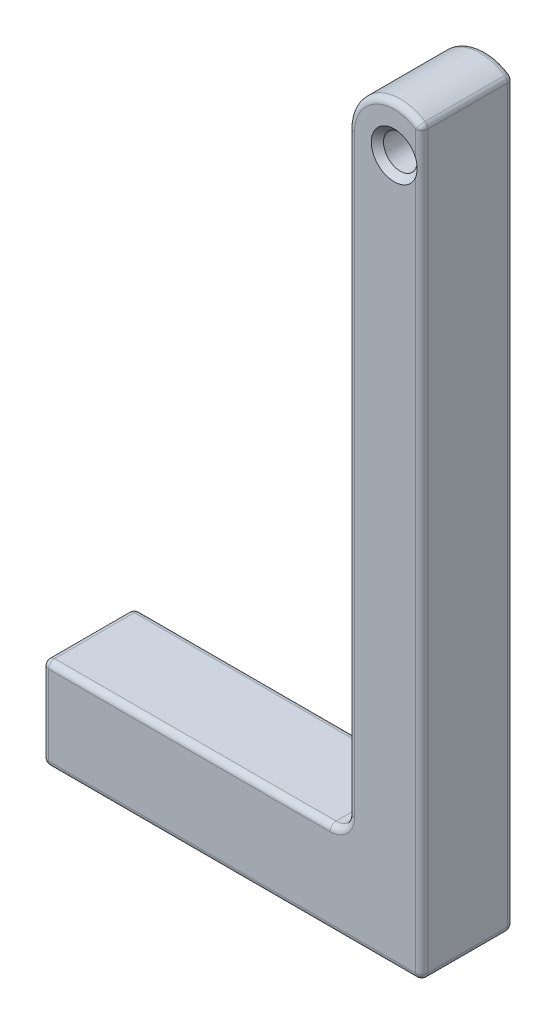
ISO-10303-21;
HEADER;
FILE_DESCRIPTION(('STEP AP214'),'2;1');
FILE_NAME('part.step','',(''),(''),'','','');
FILE_SCHEMA(('AUTOMOTIVE_DESIGN { 1 0 10303 214 1 1 1 1 }'));
ENDSEC;
DATA;
#1=APPLICATION_CONTEXT('core data for automotive mechanical design processes');
#2=APPLICATION_PROTOCOL_DEFINITION('international standard','automotive_design',2000,#1);
#3=PRODUCT_CONTEXT('',#1,'mechanical');
#4=PRODUCT('Part','Part','',(#3));
#5=PRODUCT_RELATED_PRODUCT_CATEGORY('part','',(#4));
#6=PRODUCT_DEFINITION_FORMATION('','',#4);
#7=PRODUCT_DEFINITION_CONTEXT('part definition',#1,'design');
#8=PRODUCT_DEFINITION('design','',#6,#7);
#9=PRODUCT_DEFINITION_SHAPE('','',#8);
#10=(LENGTH_UNIT() NAMED_UNIT(*) SI_UNIT(.MILLI.,.METRE.));
#11=(NAMED_UNIT(*) PLANE_ANGLE_UNIT() SI_UNIT($,.RADIAN.));
#12=(NAMED_UNIT(*) SI_UNIT($,.STERADIAN.) SOLID_ANGLE_UNIT());
#13=UNCERTAINTY_MEASURE_WITH_UNIT(LENGTH_MEASURE(1.E-05),#10,'distance_accuracy_value','');
#14=(GEOMETRIC_REPRESENTATION_CONTEXT(3) GLOBAL_UNCERTAINTY_ASSIGNED_CONTEXT((#13)) GLOBAL_UNIT_ASSIGNED_CONTEXT((#10,
#11,#12)) REPRESENTATION_CONTEXT('',''));
#15=CARTESIAN_POINT('',(0.,0.,0.));
#16=DIRECTION('',(0.,0.,1.));
#17=DIRECTION('',(1.,0.,0.));
#18=AXIS2_PLACEMENT_3D('',#15,#16,#17);
#19=CARTESIAN_POINT('',(7.50000000000001,100.,15.));
#20=DIRECTION('',(0.,0.,1.));
#21=DIRECTION('',(1.,0.,0.));
#22=AXIS2_PLACEMENT_3D('',#19,#20,#21);
#23=PLANE('',#22);
#24=DIRECTION('',(1.,0.,0.));
#25=VECTOR('',#24,1.);
#26=CARTESIAN_POINT('',(12.,-14.,15.));
#27=LINE('',#26,#25);
#28=CARTESIAN_POINT('',(-49.,-14.,15.));
#29=VERTEX_POINT('',#28);
#30=CARTESIAN_POINT('',(11.,-14.,15.));
#31=VERTEX_POINT('',#30);
#32=EDGE_CURVE('E195',#29,#31,#27,.T.);
#33=ORIENTED_EDGE('',*,*,#32,.T.);
#34=DIRECTION('',(0.,-1.,0.));
#35=VECTOR('',#34,1.);
#36=CARTESIAN_POINT('',(11.,104.690415759823,15.));
#37=LINE('',#36,#35);
#38=CARTESIAN_POINT('',(11.,98.6537087982163,15.));
#39=VERTEX_POINT('',#38);
#40=EDGE_CURVE('E375',#31,#39,#37,.F.);
#41=ORIENTED_EDGE('',*,*,#40,.T.);
#42=CARTESIAN_POINT('',(7.50000000000001,100.,15.));
#43=DIRECTION('',(0.,0.,1.));
#44=DIRECTION('',(1.,0.,0.));
#45=AXIS2_PLACEMENT_3D('',#42,#43,#44);
#46=CIRCLE('',#45,3.75);
#47=CARTESIAN_POINT('',(11.,101.346291201784,15.));
#48=VERTEX_POINT('',#47);
#49=EDGE_CURVE('E323',#39,#48,#46,.F.);
#50=ORIENTED_EDGE('',*,*,#49,.T.);
#51=DIRECTION('',(0.,-1.,0.));
#52=VECTOR('',#51,1.);
#53=CARTESIAN_POINT('',(11.,104.690415759823,15.));
#54=LINE('',#53,#52);
#55=CARTESIAN_POINT('',(11.,105.477225575052,15.));
#56=VERTEX_POINT('',#55);
#57=EDGE_CURVE('E522',#48,#56,#54,.F.);
#58=ORIENTED_EDGE('',*,*,#57,.T.);
#59=CARTESIAN_POINT('',(7.50000000000001,100.,15.));
#60=DIRECTION('',(0.,0.,1.));
#61=DIRECTION('',(1.,0.,0.));
#62=AXIS2_PLACEMENT_3D('',#59,#60,#61);
#63=CIRCLE('',#62,6.5);
#64=CARTESIAN_POINT('',(1.00000000000002,100.,15.));
#65=VERTEX_POINT('',#64);
#66=EDGE_CURVE('E248',#56,#65,#63,.T.);
#67=ORIENTED_EDGE('',*,*,#66,.T.);
#68=DIRECTION('',(0.,-1.,0.));
#69=VECTOR('',#68,1.);
#70=CARTESIAN_POINT('',(1.,3.,15.));
#71=LINE('',#70,#69);
#72=CARTESIAN_POINT('',(1.,3.,15.));
#73=VERTEX_POINT('',#72);
#74=EDGE_CURVE('E250',#65,#73,#71,.T.);
#75=ORIENTED_EDGE('',*,*,#74,.T.);
#76=CARTESIAN_POINT('',(-3.,3.,15.));
#77=DIRECTION('',(0.,0.,1.));
#78=DIRECTION('',(1.,0.,0.));
#79=AXIS2_PLACEMENT_3D('',#76,#77,#78);
#80=CIRCLE('',#79,4.);
#81=CARTESIAN_POINT('',(-3.,-1.,15.));
#82=VERTEX_POINT('',#81);
#83=EDGE_CURVE('E252',#73,#82,#80,.F.);
#84=ORIENTED_EDGE('',*,*,#83,.T.);
#85=DIRECTION('',(-1.,0.,0.));
#86=VECTOR('',#85,1.);
#87=CARTESIAN_POINT('',(-50.,-1.00000000000001,15.));
#88=LINE('',#87,#86);
#89=CARTESIAN_POINT('',(-49.,-1.00000000000001,15.));
#90=VERTEX_POINT('',#89);
#91=EDGE_CURVE('E254',#82,#90,#88,.T.);
#92=ORIENTED_EDGE('',*,*,#91,.T.);
#93=DIRECTION('',(0.,-1.,0.));
#94=VECTOR('',#93,1.);
#95=CARTESIAN_POINT('',(-49.,-15.,15.));
#96=LINE('',#95,#94);
#97=EDGE_CURVE('E246',#90,#29,#96,.T.);
#98=ORIENTED_EDGE('',*,*,#97,.T.);
#99=EDGE_LOOP('',(#33,#41,#50,#58,#67,#75,#84,#92,#98));
#100=FACE_BOUND('',#99,.T.);
#101=ADVANCED_FACE('F43',(#100),#23,.T.);
#102=CARTESIAN_POINT('',(7.50000000000001,100.,0.));
#103=DIRECTION('',(0.,0.,1.));
#104=DIRECTION('',(1.,0.,0.));
#105=AXIS2_PLACEMENT_3D('',#102,#103,#104);
#106=PLANE('',#105);
#107=CARTESIAN_POINT('',(7.50000000000001,100.,0.));
#108=DIRECTION('',(0.,0.,1.));
#109=DIRECTION('',(1.,0.,0.));
#110=AXIS2_PLACEMENT_3D('',#107,#108,#109);
#111=CIRCLE('',#110,6.5);
#112=CARTESIAN_POINT('',(1.00000000000001,100.,0.));
#113=VERTEX_POINT('',#112);
#114=CARTESIAN_POINT('',(11.,105.477225575052,0.));
#115=VERTEX_POINT('',#114);
#116=EDGE_CURVE('E227',#113,#115,#111,.F.);
#117=ORIENTED_EDGE('',*,*,#116,.T.);
#118=DIRECTION('',(0.,-1.,0.));
#119=VECTOR('',#118,1.);
#120=CARTESIAN_POINT('',(11.,100.,0.));
#121=LINE('',#120,#119);
#122=CARTESIAN_POINT('',(11.,101.346291201784,0.));
#123=VERTEX_POINT('',#122);
#124=EDGE_CURVE('E330',#115,#123,#121,.T.);
#125=ORIENTED_EDGE('',*,*,#124,.T.);
#126=CARTESIAN_POINT('',(7.50000000000001,100.,0.));
#127=DIRECTION('',(0.,0.,1.));
#128=DIRECTION('',(1.,0.,0.));
#129=AXIS2_PLACEMENT_3D('',#126,#127,#128);
#130=CIRCLE('',#129,3.74999999999999);
#131=CARTESIAN_POINT('',(11.,98.6537087982164,0.));
#132=VERTEX_POINT('',#131);
#133=EDGE_CURVE('E272',#123,#132,#130,.T.);
#134=ORIENTED_EDGE('',*,*,#133,.T.);
#135=DIRECTION('',(0.,-1.,0.));
#136=VECTOR('',#135,1.);
#137=CARTESIAN_POINT('',(11.,100.,0.));
#138=LINE('',#137,#136);
#139=CARTESIAN_POINT('',(11.,-14.,0.));
#140=VERTEX_POINT('',#139);
#141=EDGE_CURVE('E328',#132,#140,#138,.T.);
#142=ORIENTED_EDGE('',*,*,#141,.T.);
#143=DIRECTION('',(1.,0.,0.));
#144=VECTOR('',#143,1.);
#145=CARTESIAN_POINT('',(7.50000000000001,-14.,0.));
#146=LINE('',#145,#144);
#147=CARTESIAN_POINT('',(-49.,-14.,0.));
#148=VERTEX_POINT('',#147);
#149=EDGE_CURVE('E230',#140,#148,#146,.F.);
#150=ORIENTED_EDGE('',*,*,#149,.T.);
#151=DIRECTION('',(0.,-1.,0.));
#152=VECTOR('',#151,1.);
#153=CARTESIAN_POINT('',(-49.,100.,0.));
#154=LINE('',#153,#152);
#155=CARTESIAN_POINT('',(-49.,-1.00000000000001,0.));
#156=VERTEX_POINT('',#155);
#157=EDGE_CURVE('E221',#148,#156,#154,.F.);
#158=ORIENTED_EDGE('',*,*,#157,.T.);
#159=DIRECTION('',(-1.,0.,0.));
#160=VECTOR('',#159,1.);
#161=CARTESIAN_POINT('',(7.50000000000002,-1.,0.));
#162=LINE('',#161,#160);
#163=CARTESIAN_POINT('',(-3.,-1.,0.));
#164=VERTEX_POINT('',#163);
#165=EDGE_CURVE('E216',#156,#164,#162,.F.);
#166=ORIENTED_EDGE('',*,*,#165,.T.);
#167=CARTESIAN_POINT('',(-3.,3.,0.));
#168=DIRECTION('',(0.,0.,1.));
#169=DIRECTION('',(1.,0.,0.));
#170=AXIS2_PLACEMENT_3D('',#167,#168,#169);
#171=CIRCLE('',#170,4.);
#172=CARTESIAN_POINT('',(1.,3.,0.));
#173=VERTEX_POINT('',#172);
#174=EDGE_CURVE('E223',#164,#173,#171,.T.);
#175=ORIENTED_EDGE('',*,*,#174,.T.);
#176=DIRECTION('',(0.,-1.,0.));
#177=VECTOR('',#176,1.);
#178=CARTESIAN_POINT('',(1.00000000000001,100.,0.));
#179=LINE('',#178,#177);
#180=EDGE_CURVE('E225',#173,#113,#179,.F.);
#181=ORIENTED_EDGE('',*,*,#180,.T.);
#182=EDGE_LOOP('',(#117,#125,#134,#142,#150,#158,#166,#175,#181));
#183=FACE_BOUND('',#182,.T.);
#184=ADVANCED_FACE('F393',(#183),#106,.F.);
#185=CARTESIAN_POINT('',(0.,100.,15.));
#186=DIRECTION('',(1.,0.,0.));
#187=DIRECTION('',(0.,1.,0.));
#188=AXIS2_PLACEMENT_3D('',#185,#186,#187);
#189=PLANE('',#188);
#190=DIRECTION('',(0.,0.,-1.));
#191=VECTOR('',#190,1.);
#192=CARTESIAN_POINT('',(0.,100.,15.));
#193=LINE('',#192,#191);
#194=CARTESIAN_POINT('',(0.,100.,14.));
#195=VERTEX_POINT('',#194);
#196=CARTESIAN_POINT('',(0.,100.,1.));
#197=VERTEX_POINT('',#196);
#198=EDGE_CURVE('E314',#195,#197,#193,.T.);
#199=ORIENTED_EDGE('',*,*,#198,.T.);
#200=DIRECTION('',(0.,-1.,0.));
#201=VECTOR('',#200,1.);
#202=CARTESIAN_POINT('',(0.,100.,1.));
#203=LINE('',#202,#201);
#204=CARTESIAN_POINT('',(0.,3.,1.));
#205=VERTEX_POINT('',#204);
#206=EDGE_CURVE('E239',#197,#205,#203,.T.);
#207=ORIENTED_EDGE('',*,*,#206,.T.);
#208=DIRECTION('',(0.,0.,-1.));
#209=VECTOR('',#208,1.);
#210=CARTESIAN_POINT('',(0.,3.,15.));
#211=LINE('',#210,#209);
#212=CARTESIAN_POINT('',(0.,3.,14.));
#213=VERTEX_POINT('',#212);
#214=EDGE_CURVE('E187',#205,#213,#211,.F.);
#215=ORIENTED_EDGE('',*,*,#214,.T.);
#216=DIRECTION('',(0.,-1.,0.));
#217=VECTOR('',#216,1.);
#218=CARTESIAN_POINT('',(0.,100.,14.));
#219=LINE('',#218,#217);
#220=EDGE_CURVE('E237',#213,#195,#219,.F.);
#221=ORIENTED_EDGE('',*,*,#220,.T.);
#222=EDGE_LOOP('',(#199,#207,#215,#221));
#223=FACE_BOUND('',#222,.T.);
#224=ADVANCED_FACE('F400',(#223),#189,.F.);
#225=CARTESIAN_POINT('',(0.,0.,15.));
#226=DIRECTION('',(0.,-1.,0.));
#227=DIRECTION('',(1.,0.,0.));
#228=AXIS2_PLACEMENT_3D('',#225,#226,#227);
#229=PLANE('',#228);
#230=DIRECTION('',(0.,0.,-1.));
#231=VECTOR('',#230,1.);
#232=CARTESIAN_POINT('',(-49.,0.,15.));
#233=LINE('',#232,#231);
#234=CARTESIAN_POINT('',(-49.,0.,1.));
#235=VERTEX_POINT('',#234);
#236=CARTESIAN_POINT('',(-49.,0.,14.));
#237=VERTEX_POINT('',#236);
#238=EDGE_CURVE('E259',#235,#237,#233,.F.);
#239=ORIENTED_EDGE('',*,*,#238,.T.);
#240=DIRECTION('',(-1.,0.,0.));
#241=VECTOR('',#240,1.);
#242=CARTESIAN_POINT('',(-3.,0.,14.));
#243=LINE('',#242,#241);
#244=CARTESIAN_POINT('',(-3.,0.,14.));
#245=VERTEX_POINT('',#244);
#246=EDGE_CURVE('E261',#237,#245,#243,.F.);
#247=ORIENTED_EDGE('',*,*,#246,.T.);
#248=DIRECTION('',(0.,0.,-1.));
#249=VECTOR('',#248,1.);
#250=CARTESIAN_POINT('',(-3.,0.,0.));
#251=LINE('',#250,#249);
#252=CARTESIAN_POINT('',(-3.,0.,1.));
#253=VERTEX_POINT('',#252);
#254=EDGE_CURVE('E812',#245,#253,#251,.T.);
#255=ORIENTED_EDGE('',*,*,#254,.T.);
#256=DIRECTION('',(-1.,0.,0.));
#257=VECTOR('',#256,1.);
#258=CARTESIAN_POINT('',(0.,0.,1.));
#259=LINE('',#258,#257);
#260=EDGE_CURVE('E257',#253,#235,#259,.T.);
#261=ORIENTED_EDGE('',*,*,#260,.T.);
#262=EDGE_LOOP('',(#239,#247,#255,#261));
#263=FACE_BOUND('',#262,.T.);
#264=ADVANCED_FACE('F416',(#263),#229,.F.);
#265=CARTESIAN_POINT('',(-50.,0.,15.));
#266=DIRECTION('',(1.,0.,0.));
#267=DIRECTION('',(0.,0.,-1.));
#268=AXIS2_PLACEMENT_3D('',#265,#266,#267);
#269=PLANE('',#268);
#270=DIRECTION('',(0.,-1.,0.));
#271=VECTOR('',#270,1.);
#272=CARTESIAN_POINT('',(-50.,0.,14.));
#273=LINE('',#272,#271);
#274=CARTESIAN_POINT('',(-50.,-14.,14.));
#275=VERTEX_POINT('',#274);
#276=CARTESIAN_POINT('',(-50.,-1.00000000000001,14.));
#277=VERTEX_POINT('',#276);
#278=EDGE_CURVE('E263',#275,#277,#273,.F.);
#279=ORIENTED_EDGE('',*,*,#278,.T.);
#280=DIRECTION('',(0.,0.,-1.));
#281=VECTOR('',#280,1.);
#282=CARTESIAN_POINT('',(-50.,-1.00000000000001,15.));
#283=LINE('',#282,#281);
#284=CARTESIAN_POINT('',(-50.,-1.00000000000001,1.));
#285=VERTEX_POINT('',#284);
#286=EDGE_CURVE('E269',#277,#285,#283,.T.);
#287=ORIENTED_EDGE('',*,*,#286,.T.);
#288=DIRECTION('',(0.,-1.,0.));
#289=VECTOR('',#288,1.);
#290=CARTESIAN_POINT('',(-50.,0.,1.));
#291=LINE('',#290,#289);
#292=CARTESIAN_POINT('',(-50.,-14.,1.));
#293=VERTEX_POINT('',#292);
#294=EDGE_CURVE('E267',#285,#293,#291,.T.);
#295=ORIENTED_EDGE('',*,*,#294,.T.);
#296=DIRECTION('',(0.,0.,-1.));
#297=VECTOR('',#296,1.);
#298=CARTESIAN_POINT('',(-50.,-14.,15.));
#299=LINE('',#298,#297);
#300=EDGE_CURVE('E265',#293,#275,#299,.F.);
#301=ORIENTED_EDGE('',*,*,#300,.T.);
#302=EDGE_LOOP('',(#279,#287,#295,#301));
#303=FACE_BOUND('',#302,.T.);
#304=ADVANCED_FACE('F413',(#303),#269,.F.);
#305=CARTESIAN_POINT('',(-50.,-15.,15.));
#306=DIRECTION('',(0.,1.,0.));
#307=DIRECTION('',(-1.,0.,0.));
#308=AXIS2_PLACEMENT_3D('',#305,#306,#307);
#309=PLANE('',#308);
#310=DIRECTION('',(1.,0.,0.));
#311=VECTOR('',#310,1.);
#312=CARTESIAN_POINT('',(-50.,-15.,1.));
#313=LINE('',#312,#311);
#314=CARTESIAN_POINT('',(-49.,-15.,1.));
#315=VERTEX_POINT('',#314);
#316=CARTESIAN_POINT('',(11.,-15.,1.));
#317=VERTEX_POINT('',#316);
#318=EDGE_CURVE('E214',#315,#317,#313,.T.);
#319=ORIENTED_EDGE('',*,*,#318,.T.);
#320=DIRECTION('',(0.,0.,1.));
#321=VECTOR('',#320,1.);
#322=CARTESIAN_POINT('',(11.,-15.,15.));
#323=LINE('',#322,#321);
#324=CARTESIAN_POINT('',(11.,-15.,14.));
#325=VERTEX_POINT('',#324);
#326=EDGE_CURVE('E11',#317,#325,#323,.T.);
#327=ORIENTED_EDGE('',*,*,#326,.T.);
#328=DIRECTION('',(1.,0.,0.));
#329=VECTOR('',#328,1.);
#330=CARTESIAN_POINT('',(-50.,-15.,14.));
#331=LINE('',#330,#329);
#332=CARTESIAN_POINT('',(-49.,-15.,14.));
#333=VERTEX_POINT('',#332);
#334=EDGE_CURVE('E179',#325,#333,#331,.F.);
#335=ORIENTED_EDGE('',*,*,#334,.T.);
#336=DIRECTION('',(0.,0.,-1.));
#337=VECTOR('',#336,1.);
#338=CARTESIAN_POINT('',(-49.,-15.,15.));
#339=LINE('',#338,#337);
#340=EDGE_CURVE('E183',#333,#315,#339,.T.);
#341=ORIENTED_EDGE('',*,*,#340,.T.);
#342=EDGE_LOOP('',(#319,#327,#335,#341));
#343=FACE_BOUND('',#342,.T.);
#344=ADVANCED_FACE('F181',(#343),#309,.F.);
#345=CARTESIAN_POINT('',(7.50000000000001,100.,15.));
#346=DIRECTION('',(0.,0.,-1.));
#347=DIRECTION('',(-1.,0.,0.));
#348=AXIS2_PLACEMENT_3D('',#345,#346,#347);
#349=CYLINDRICAL_SURFACE('',#348,7.5);
#350=CARTESIAN_POINT('',(7.50000000000001,100.,14.));
#351=DIRECTION('',(0.,0.,1.));
#352=DIRECTION('',(1.,0.,0.));
#353=AXIS2_PLACEMENT_3D('',#350,#351,#352);
#354=CIRCLE('',#353,7.5);
#355=CARTESIAN_POINT('',(11.5384615384615,106.319875663521,14.));
#356=VERTEX_POINT('',#355);
#357=EDGE_CURVE('E232',#195,#356,#354,.F.);
#358=ORIENTED_EDGE('',*,*,#357,.T.);
#359=DIRECTION('',(0.,0.,-1.));
#360=VECTOR('',#359,1.);
#361=CARTESIAN_POINT('',(11.5384615384615,106.319875663521,15.));
#362=LINE('',#361,#360);
#363=CARTESIAN_POINT('',(11.5384615384615,106.319875663521,1.));
#364=VERTEX_POINT('',#363);
#365=EDGE_CURVE('E505',#356,#364,#362,.T.);
#366=ORIENTED_EDGE('',*,*,#365,.T.);
#367=CARTESIAN_POINT('',(7.50000000000001,100.,1.));
#368=DIRECTION('',(0.,0.,1.));
#369=DIRECTION('',(1.,0.,0.));
#370=AXIS2_PLACEMENT_3D('',#367,#368,#369);
#371=CIRCLE('',#370,7.5);
#372=EDGE_CURVE('E235',#364,#197,#371,.T.);
#373=ORIENTED_EDGE('',*,*,#372,.T.);
#374=ORIENTED_EDGE('',*,*,#198,.F.);
#375=EDGE_LOOP('',(#358,#366,#373,#374));
#376=FACE_BOUND('',#375,.T.);
#377=ADVANCED_FACE('F407',(#376),#349,.T.);
#378=CARTESIAN_POINT('',(7.50000000000001,100.,15.));
#379=DIRECTION('',(0.,0.,-1.));
#380=DIRECTION('',(-1.,0.,0.));
#381=AXIS2_PLACEMENT_3D('',#378,#379,#380);
#382=CYLINDRICAL_SURFACE('',#381,2.75);
#383=CARTESIAN_POINT('',(7.50000000000001,100.,0.99999999999999));
#384=DIRECTION('',(0.,0.,1.));
#385=DIRECTION('',(1.,0.,0.));
#386=AXIS2_PLACEMENT_3D('',#383,#384,#385);
#387=CIRCLE('',#386,2.75);
#388=CARTESIAN_POINT('',(10.25,100.,0.99999999999999));
#389=VERTEX_POINT('',#388);
#390=EDGE_CURVE('E320',#389,#389,#387,.F.);
#391=ORIENTED_EDGE('',*,*,#390,.T.);
#392=EDGE_LOOP('',(#391));
#393=FACE_BOUND('',#392,.T.);
#394=CARTESIAN_POINT('',(7.50000000000001,100.,14.));
#395=DIRECTION('',(0.,0.,1.));
#396=DIRECTION('',(1.,0.,0.));
#397=AXIS2_PLACEMENT_3D('',#394,#395,#396);
#398=CIRCLE('',#397,2.75);
#399=CARTESIAN_POINT('',(10.25,100.,14.));
#400=VERTEX_POINT('',#399);
#401=EDGE_CURVE('E317',#400,#400,#398,.T.);
#402=ORIENTED_EDGE('',*,*,#401,.T.);
#403=EDGE_LOOP('',(#402));
#404=FACE_BOUND('',#403,.T.);
#405=ADVANCED_FACE('F404',(#393,#404),#382,.F.);
#406=CARTESIAN_POINT('',(-3.,3.,15.));
#407=DIRECTION('',(0.,0.,1.));
#408=DIRECTION('',(1.,0.,0.));
#409=AXIS2_PLACEMENT_3D('',#406,#407,#408);
#410=CYLINDRICAL_SURFACE('',#409,3.);
#411=ORIENTED_EDGE('',*,*,#214,.F.);
#412=CARTESIAN_POINT('',(-3.,3.,1.));
#413=DIRECTION('',(0.,0.,1.));
#414=DIRECTION('',(1.,0.,0.));
#415=AXIS2_PLACEMENT_3D('',#412,#413,#414);
#416=CIRCLE('',#415,3.);
#417=EDGE_CURVE('E243',#205,#253,#416,.F.);
#418=ORIENTED_EDGE('',*,*,#417,.T.);
#419=ORIENTED_EDGE('',*,*,#254,.F.);
#420=CARTESIAN_POINT('',(-3.,3.,14.));
#421=DIRECTION('',(0.,0.,1.));
#422=DIRECTION('',(1.,0.,0.));
#423=AXIS2_PLACEMENT_3D('',#420,#421,#422);
#424=CIRCLE('',#423,3.);
#425=EDGE_CURVE('E241',#245,#213,#424,.T.);
#426=ORIENTED_EDGE('',*,*,#425,.T.);
#427=EDGE_LOOP('',(#411,#418,#419,#426));
#428=FACE_BOUND('',#427,.T.);
#429=ADVANCED_FACE('F424',(#428),#410,.F.);
#430=CARTESIAN_POINT('',(1.00000000000001,100.,14.));
#431=DIRECTION('',(0.,1.,0.));
#432=DIRECTION('',(-1.,0.,0.));
#433=AXIS2_PLACEMENT_3D('',#430,#431,#432);
#434=CYLINDRICAL_SURFACE('',#433,1.);
#435=CARTESIAN_POINT('',(1.00000000000001,100.,14.));
#436=DIRECTION('',(0.,1.,0.));
#437=DIRECTION('',(0.,0.,1.));
#438=AXIS2_PLACEMENT_3D('',#435,#436,#437);
#439=CIRCLE('',#438,1.);
#440=EDGE_CURVE('E308',#195,#65,#439,.T.);
#441=ORIENTED_EDGE('',*,*,#440,.F.);
#442=ORIENTED_EDGE('',*,*,#220,.F.);
#443=CARTESIAN_POINT('',(1.,3.,14.));
#444=DIRECTION('',(0.,-1.,0.));
#445=DIRECTION('',(0.,0.,-1.));
#446=AXIS2_PLACEMENT_3D('',#443,#444,#445);
#447=CIRCLE('',#446,1.);
#448=EDGE_CURVE('E311',#73,#213,#447,.T.);
#449=ORIENTED_EDGE('',*,*,#448,.F.);
#450=ORIENTED_EDGE('',*,*,#74,.F.);
#451=EDGE_LOOP('',(#441,#442,#449,#450));
#452=FACE_BOUND('',#451,.T.);
#453=ADVANCED_FACE('F427',(#452),#434,.T.);
#454=CARTESIAN_POINT('',(-3.,3.,14.));
#455=DIRECTION('',(0.,0.,1.));
#456=DIRECTION('',(1.,0.,0.));
#457=AXIS2_PLACEMENT_3D('',#454,#455,#456);
#458=TOROIDAL_SURFACE('',#457,4.,1.);
#459=ORIENTED_EDGE('',*,*,#448,.T.);
#460=ORIENTED_EDGE('',*,*,#425,.F.);
#461=CARTESIAN_POINT('',(-3.,-1.,14.));
#462=DIRECTION('',(-1.,0.,0.));
#463=DIRECTION('',(0.,0.,1.));
#464=AXIS2_PLACEMENT_3D('',#461,#462,#463);
#465=CIRCLE('',#464,1.);
#466=EDGE_CURVE('E305',#82,#245,#465,.T.);
#467=ORIENTED_EDGE('',*,*,#466,.F.);
#468=ORIENTED_EDGE('',*,*,#83,.F.);
#469=EDGE_LOOP('',(#459,#460,#467,#468));
#470=FACE_BOUND('',#469,.T.);
#471=ADVANCED_FACE('F486',(#470),#458,.T.);
#472=CARTESIAN_POINT('',(7.50000000000001,100.,14.));
#473=DIRECTION('',(0.,0.,1.));
#474=DIRECTION('',(1.,0.,0.));
#475=AXIS2_PLACEMENT_3D('',#472,#473,#474);
#476=TOROIDAL_SURFACE('',#475,6.5,1.);
#477=ORIENTED_EDGE('',*,*,#66,.F.);
#478=CARTESIAN_POINT('',(11.,105.477225575052,14.));
#479=DIRECTION('',(-0.842650088469487,0.538461538461537,0.));
#480=DIRECTION('',(-0.538461538461537,-0.842650088469487,0.));
#481=AXIS2_PLACEMENT_3D('',#478,#479,#480);
#482=CIRCLE('',#481,1.);
#483=EDGE_CURVE('E501',#56,#356,#482,.T.);
#484=ORIENTED_EDGE('',*,*,#483,.T.);
#485=ORIENTED_EDGE('',*,*,#357,.F.);
#486=ORIENTED_EDGE('',*,*,#440,.T.);
#487=EDGE_LOOP('',(#477,#484,#485,#486));
#488=FACE_BOUND('',#487,.T.);
#489=ADVANCED_FACE('F482',(#488),#476,.T.);
#490=CARTESIAN_POINT('',(7.50000000000002,-1.,14.));
#491=DIRECTION('',(1.,0.,0.));
#492=DIRECTION('',(0.,1.,0.));
#493=AXIS2_PLACEMENT_3D('',#490,#491,#492);
#494=CYLINDRICAL_SURFACE('',#493,1.);
#495=ORIENTED_EDGE('',*,*,#466,.T.);
#496=ORIENTED_EDGE('',*,*,#246,.F.);
#497=CARTESIAN_POINT('',(-49.,-1.00000000000001,14.));
#498=DIRECTION('',(-1.,0.,0.));
#499=DIRECTION('',(0.,0.,1.));
#500=AXIS2_PLACEMENT_3D('',#497,#498,#499);
#501=CIRCLE('',#500,1.);
#502=EDGE_CURVE('E302',#90,#237,#501,.T.);
#503=ORIENTED_EDGE('',*,*,#502,.F.);
#504=ORIENTED_EDGE('',*,*,#91,.F.);
#505=EDGE_LOOP('',(#495,#496,#503,#504));
#506=FACE_BOUND('',#505,.T.);
#507=ADVANCED_FACE('F478',(#506),#494,.T.);
#508=CARTESIAN_POINT('',(-49.,-1.00000000000001,14.));
#509=DIRECTION('',(0.,1.,0.));
#510=DIRECTION('',(0.,0.,1.));
#511=AXIS2_PLACEMENT_3D('',#508,#509,#510);
#512=SPHERICAL_SURFACE('',#511,1.);
#513=CARTESIAN_POINT('',(-49.,-1.00000000000001,14.));
#514=DIRECTION('',(0.,1.,0.));
#515=DIRECTION('',(0.,0.,1.));
#516=AXIS2_PLACEMENT_3D('',#513,#514,#515);
#517=CIRCLE('',#516,1.);
#518=EDGE_CURVE('E293',#90,#277,#517,.F.);
#519=ORIENTED_EDGE('',*,*,#518,.F.);
#520=ORIENTED_EDGE('',*,*,#502,.T.);
#521=CARTESIAN_POINT('',(-49.,-1.00000000000001,14.));
#522=DIRECTION('',(0.,0.,1.));
#523=DIRECTION('',(1.,0.,0.));
#524=AXIS2_PLACEMENT_3D('',#521,#522,#523);
#525=CIRCLE('',#524,1.);
#526=EDGE_CURVE('E296',#277,#237,#525,.F.);
#527=ORIENTED_EDGE('',*,*,#526,.F.);
#528=EDGE_LOOP('',(#519,#520,#527));
#529=FACE_BOUND('',#528,.T.);
#530=ADVANCED_FACE('F474',(#529),#512,.T.);
#531=CARTESIAN_POINT('',(-3.,3.,1.));
#532=DIRECTION('',(0.,0.,1.));
#533=DIRECTION('',(1.,0.,0.));
#534=AXIS2_PLACEMENT_3D('',#531,#532,#533);
#535=TOROIDAL_SURFACE('',#534,4.,1.);
#536=CARTESIAN_POINT('',(1.,3.,1.));
#537=DIRECTION('',(0.,1.,0.));
#538=DIRECTION('',(0.,0.,1.));
#539=AXIS2_PLACEMENT_3D('',#536,#537,#538);
#540=CIRCLE('',#539,1.);
#541=EDGE_CURVE('E290',#173,#205,#540,.T.);
#542=ORIENTED_EDGE('',*,*,#541,.F.);
#543=ORIENTED_EDGE('',*,*,#174,.F.);
#544=CARTESIAN_POINT('',(-3.,-1.,1.));
#545=DIRECTION('',(-1.,0.,0.));
#546=DIRECTION('',(0.,0.,1.));
#547=AXIS2_PLACEMENT_3D('',#544,#545,#546);
#548=CIRCLE('',#547,1.);
#549=EDGE_CURVE('E299',#253,#164,#548,.T.);
#550=ORIENTED_EDGE('',*,*,#549,.F.);
#551=ORIENTED_EDGE('',*,*,#417,.F.);
#552=EDGE_LOOP('',(#542,#543,#550,#551));
#553=FACE_BOUND('',#552,.T.);
#554=ADVANCED_FACE('F470',(#553),#535,.T.);
#555=CARTESIAN_POINT('',(0.,-1.,1.));
#556=DIRECTION('',(-1.,0.,0.));
#557=DIRECTION('',(0.,-1.,0.));
#558=AXIS2_PLACEMENT_3D('',#555,#556,#557);
#559=CYLINDRICAL_SURFACE('',#558,1.);
#560=ORIENTED_EDGE('',*,*,#549,.T.);
#561=ORIENTED_EDGE('',*,*,#165,.F.);
#562=CARTESIAN_POINT('',(-49.,-1.00000000000001,1.));
#563=DIRECTION('',(-1.,0.,0.));
#564=DIRECTION('',(0.,0.,1.));
#565=AXIS2_PLACEMENT_3D('',#562,#563,#564);
#566=CIRCLE('',#565,1.);
#567=EDGE_CURVE('E287',#235,#156,#566,.T.);
#568=ORIENTED_EDGE('',*,*,#567,.F.);
#569=ORIENTED_EDGE('',*,*,#260,.F.);
#570=EDGE_LOOP('',(#560,#561,#568,#569));
#571=FACE_BOUND('',#570,.T.);
#572=ADVANCED_FACE('F466',(#571),#559,.T.);
#573=CARTESIAN_POINT('',(-49.,-1.00000000000001,15.));
#574=DIRECTION('',(0.,0.,-1.));
#575=DIRECTION('',(-1.,0.,0.));
#576=AXIS2_PLACEMENT_3D('',#573,#574,#575);
#577=CYLINDRICAL_SURFACE('',#576,1.);
#578=ORIENTED_EDGE('',*,*,#526,.T.);
#579=ORIENTED_EDGE('',*,*,#238,.F.);
#580=CARTESIAN_POINT('',(-49.,-1.00000000000001,1.));
#581=DIRECTION('',(0.,0.,-1.));
#582=DIRECTION('',(-1.,0.,0.));
#583=AXIS2_PLACEMENT_3D('',#580,#581,#582);
#584=CIRCLE('',#583,1.);
#585=EDGE_CURVE('E284',#285,#235,#584,.T.);
#586=ORIENTED_EDGE('',*,*,#585,.F.);
#587=ORIENTED_EDGE('',*,*,#286,.F.);
#588=EDGE_LOOP('',(#578,#579,#586,#587));
#589=FACE_BOUND('',#588,.T.);
#590=ADVANCED_FACE('F462',(#589),#577,.T.);
#591=CARTESIAN_POINT('',(-49.,100.,14.));
#592=DIRECTION('',(0.,1.,0.));
#593=DIRECTION('',(0.,0.,1.));
#594=AXIS2_PLACEMENT_3D('',#591,#592,#593);
#595=CYLINDRICAL_SURFACE('',#594,1.);
#596=ORIENTED_EDGE('',*,*,#518,.T.);
#597=ORIENTED_EDGE('',*,*,#278,.F.);
#598=CARTESIAN_POINT('',(-49.,-14.,14.));
#599=DIRECTION('',(0.,-1.,0.));
#600=DIRECTION('',(1.,0.,0.));
#601=AXIS2_PLACEMENT_3D('',#598,#599,#600);
#602=CIRCLE('',#601,1.);
#603=EDGE_CURVE('E199',#29,#275,#602,.T.);
#604=ORIENTED_EDGE('',*,*,#603,.F.);
#605=ORIENTED_EDGE('',*,*,#97,.F.);
#606=EDGE_LOOP('',(#596,#597,#604,#605));
#607=FACE_BOUND('',#606,.T.);
#608=ADVANCED_FACE('F459',(#607),#595,.T.);
#609=CARTESIAN_POINT('',(7.50000000000001,-14.,14.));
#610=DIRECTION('',(-1.,0.,0.));
#611=DIRECTION('',(0.,-1.,0.));
#612=AXIS2_PLACEMENT_3D('',#609,#610,#611);
#613=CYLINDRICAL_SURFACE('',#612,1.);
#614=ORIENTED_EDGE('',*,*,#334,.F.);
#615=CARTESIAN_POINT('',(11.,-14.,14.));
#616=DIRECTION('',(-1.,0.,0.));
#617=DIRECTION('',(0.,-1.,0.));
#618=AXIS2_PLACEMENT_3D('',#615,#616,#617);
#619=CIRCLE('',#618,1.);
#620=EDGE_CURVE('E52',#325,#31,#619,.T.);
#621=ORIENTED_EDGE('',*,*,#620,.T.);
#622=ORIENTED_EDGE('',*,*,#32,.F.);
#623=CARTESIAN_POINT('',(-49.,-14.,14.));
#624=DIRECTION('',(-1.,0.,0.));
#625=DIRECTION('',(0.,0.,1.));
#626=AXIS2_PLACEMENT_3D('',#623,#624,#625);
#627=CIRCLE('',#626,1.);
#628=EDGE_CURVE('E191',#333,#29,#627,.T.);
#629=ORIENTED_EDGE('',*,*,#628,.F.);
#630=EDGE_LOOP('',(#614,#621,#622,#629));
#631=FACE_BOUND('',#630,.T.);
#632=ADVANCED_FACE('F193',(#631),#613,.T.);
#633=CARTESIAN_POINT('',(1.00000000000001,100.,1.));
#634=DIRECTION('',(0.,-1.,0.));
#635=DIRECTION('',(1.,0.,0.));
#636=AXIS2_PLACEMENT_3D('',#633,#634,#635);
#637=CYLINDRICAL_SURFACE('',#636,1.);
#638=ORIENTED_EDGE('',*,*,#541,.T.);
#639=ORIENTED_EDGE('',*,*,#206,.F.);
#640=CARTESIAN_POINT('',(1.00000000000001,100.,1.));
#641=DIRECTION('',(0.,1.,0.));
#642=DIRECTION('',(0.,0.,1.));
#643=AXIS2_PLACEMENT_3D('',#640,#641,#642);
#644=CIRCLE('',#643,1.);
#645=EDGE_CURVE('E200',#113,#197,#644,.T.);
#646=ORIENTED_EDGE('',*,*,#645,.F.);
#647=ORIENTED_EDGE('',*,*,#180,.F.);
#648=EDGE_LOOP('',(#638,#639,#646,#647));
#649=FACE_BOUND('',#648,.T.);
#650=ADVANCED_FACE('F452',(#649),#637,.T.);
#651=CARTESIAN_POINT('',(-49.,-1.00000000000001,1.));
#652=DIRECTION('',(0.,1.,0.));
#653=DIRECTION('',(0.,0.,1.));
#654=AXIS2_PLACEMENT_3D('',#651,#652,#653);
#655=SPHERICAL_SURFACE('',#654,1.);
#656=ORIENTED_EDGE('',*,*,#585,.T.);
#657=ORIENTED_EDGE('',*,*,#567,.T.);
#658=CARTESIAN_POINT('',(-49.,-1.00000000000001,1.));
#659=DIRECTION('',(0.,1.,0.));
#660=DIRECTION('',(0.,0.,1.));
#661=AXIS2_PLACEMENT_3D('',#658,#659,#660);
#662=CIRCLE('',#661,1.);
#663=EDGE_CURVE('E207',#285,#156,#662,.F.);
#664=ORIENTED_EDGE('',*,*,#663,.F.);
#665=EDGE_LOOP('',(#656,#657,#664));
#666=FACE_BOUND('',#665,.T.);
#667=ADVANCED_FACE('F449',(#666),#655,.T.);
#668=CARTESIAN_POINT('',(-49.,-14.,14.));
#669=DIRECTION('',(0.,0.,1.));
#670=DIRECTION('',(0.,-1.,0.));
#671=AXIS2_PLACEMENT_3D('',#668,#669,#670);
#672=SPHERICAL_SURFACE('',#671,1.);
#673=ORIENTED_EDGE('',*,*,#628,.T.);
#674=ORIENTED_EDGE('',*,*,#603,.T.);
#675=CARTESIAN_POINT('',(-49.,-14.,14.));
#676=DIRECTION('',(0.,0.,1.));
#677=DIRECTION('',(1.,0.,0.));
#678=AXIS2_PLACEMENT_3D('',#675,#676,#677);
#679=CIRCLE('',#678,1.);
#680=EDGE_CURVE('E203',#333,#275,#679,.F.);
#681=ORIENTED_EDGE('',*,*,#680,.F.);
#682=EDGE_LOOP('',(#673,#674,#681));
#683=FACE_BOUND('',#682,.T.);
#684=ADVANCED_FACE('F204',(#683),#672,.T.);
#685=CARTESIAN_POINT('',(7.50000000000001,100.,1.));
#686=DIRECTION('',(0.,0.,1.));
#687=DIRECTION('',(1.,0.,0.));
#688=AXIS2_PLACEMENT_3D('',#685,#686,#687);
#689=TOROIDAL_SURFACE('',#688,6.5,1.);
#690=ORIENTED_EDGE('',*,*,#372,.F.);
#691=CARTESIAN_POINT('',(11.,105.477225575052,1.));
#692=DIRECTION('',(-0.842650088469487,0.538461538461537,0.));
#693=DIRECTION('',(-0.538461538461537,-0.842650088469487,0.));
#694=AXIS2_PLACEMENT_3D('',#691,#692,#693);
#695=CIRCLE('',#694,1.);
#696=EDGE_CURVE('E520',#364,#115,#695,.T.);
#697=ORIENTED_EDGE('',*,*,#696,.T.);
#698=ORIENTED_EDGE('',*,*,#116,.F.);
#699=ORIENTED_EDGE('',*,*,#645,.T.);
#700=EDGE_LOOP('',(#690,#697,#698,#699));
#701=FACE_BOUND('',#700,.T.);
#702=ADVANCED_FACE('F442',(#701),#689,.T.);
#703=CARTESIAN_POINT('',(-49.,0.,1.));
#704=DIRECTION('',(0.,-1.,0.));
#705=DIRECTION('',(0.,0.,-1.));
#706=AXIS2_PLACEMENT_3D('',#703,#704,#705);
#707=CYLINDRICAL_SURFACE('',#706,1.);
#708=ORIENTED_EDGE('',*,*,#663,.T.);
#709=ORIENTED_EDGE('',*,*,#157,.F.);
#710=CARTESIAN_POINT('',(-49.,-14.,1.));
#711=DIRECTION('',(0.,-1.,0.));
#712=DIRECTION('',(0.,0.,-1.));
#713=AXIS2_PLACEMENT_3D('',#710,#711,#712);
#714=CIRCLE('',#713,1.);
#715=EDGE_CURVE('E208',#293,#148,#714,.T.);
#716=ORIENTED_EDGE('',*,*,#715,.F.);
#717=ORIENTED_EDGE('',*,*,#294,.F.);
#718=EDGE_LOOP('',(#708,#709,#716,#717));
#719=FACE_BOUND('',#718,.T.);
#720=ADVANCED_FACE('F439',(#719),#707,.T.);
#721=CARTESIAN_POINT('',(-49.,-14.,15.));
#722=DIRECTION('',(0.,0.,-1.));
#723=DIRECTION('',(-1.,0.,0.));
#724=AXIS2_PLACEMENT_3D('',#721,#722,#723);
#725=CYLINDRICAL_SURFACE('',#724,1.);
#726=ORIENTED_EDGE('',*,*,#680,.T.);
#727=ORIENTED_EDGE('',*,*,#300,.F.);
#728=CARTESIAN_POINT('',(-49.,-14.,1.));
#729=DIRECTION('',(0.,0.,-1.));
#730=DIRECTION('',(-1.,0.,0.));
#731=AXIS2_PLACEMENT_3D('',#728,#729,#730);
#732=CIRCLE('',#731,1.);
#733=EDGE_CURVE('E212',#315,#293,#732,.T.);
#734=ORIENTED_EDGE('',*,*,#733,.F.);
#735=ORIENTED_EDGE('',*,*,#340,.F.);
#736=EDGE_LOOP('',(#726,#727,#734,#735));
#737=FACE_BOUND('',#736,.T.);
#738=ADVANCED_FACE('F210',(#737),#725,.T.);
#739=CARTESIAN_POINT('',(-49.,-14.,1.));
#740=DIRECTION('',(-1.,0.,0.));
#741=DIRECTION('',(0.,0.,1.));
#742=AXIS2_PLACEMENT_3D('',#739,#740,#741);
#743=SPHERICAL_SURFACE('',#742,1.);
#744=ORIENTED_EDGE('',*,*,#733,.T.);
#745=ORIENTED_EDGE('',*,*,#715,.T.);
#746=CARTESIAN_POINT('',(-49.,-14.,1.));
#747=DIRECTION('',(-1.,0.,0.));
#748=DIRECTION('',(0.,0.,1.));
#749=AXIS2_PLACEMENT_3D('',#746,#747,#748);
#750=CIRCLE('',#749,1.);
#751=EDGE_CURVE('E273',#315,#148,#750,.F.);
#752=ORIENTED_EDGE('',*,*,#751,.F.);
#753=EDGE_LOOP('',(#744,#745,#752));
#754=FACE_BOUND('',#753,.T.);
#755=ADVANCED_FACE('F432',(#754),#743,.T.);
#756=CARTESIAN_POINT('',(-50.,-14.,1.));
#757=DIRECTION('',(1.,0.,0.));
#758=DIRECTION('',(0.,1.,0.));
#759=AXIS2_PLACEMENT_3D('',#756,#757,#758);
#760=CYLINDRICAL_SURFACE('',#759,1.);
#761=ORIENTED_EDGE('',*,*,#149,.F.);
#762=CARTESIAN_POINT('',(11.,-14.,1.));
#763=DIRECTION('',(1.,0.,0.));
#764=DIRECTION('',(0.,1.,0.));
#765=AXIS2_PLACEMENT_3D('',#762,#763,#764);
#766=CIRCLE('',#765,1.);
#767=EDGE_CURVE('E325',#140,#317,#766,.F.);
#768=ORIENTED_EDGE('',*,*,#767,.T.);
#769=ORIENTED_EDGE('',*,*,#318,.F.);
#770=ORIENTED_EDGE('',*,*,#751,.T.);
#771=EDGE_LOOP('',(#761,#768,#769,#770));
#772=FACE_BOUND('',#771,.T.);
#773=ADVANCED_FACE('F429',(#772),#760,.T.);
#774=CARTESIAN_POINT('',(7.50000000000001,100.,0.));
#775=DIRECTION('',(0.,0.,-1.));
#776=DIRECTION('',(-1.,0.,0.));
#777=AXIS2_PLACEMENT_3D('',#774,#775,#776);
#778=CONICAL_SURFACE('',#777,3.74999999999999,0.785398163397447);
#779=ORIENTED_EDGE('',*,*,#390,.F.);
#780=EDGE_LOOP('',(#779));
#781=FACE_BOUND('',#780,.T.);
#782=ORIENTED_EDGE('',*,*,#133,.F.);
#783=CARTESIAN_POINT('',(11.,101.346291201784,0.));
#784=CARTESIAN_POINT('',(11.0151631701915,101.30684741313,8.59741666697124E-06));
#785=CARTESIAN_POINT('',(11.0293486047806,101.267044495281,0.00034415630811834));
#786=CARTESIAN_POINT('',(11.0559208398019,101.186867081075,0.00147438907906253));
#787=CARTESIAN_POINT('',(11.0683084434476,101.146492848867,0.00226885713761907));
#788=CARTESIAN_POINT('',(11.1029892536743,101.024817145186,0.00504611310361578));
#789=CARTESIAN_POINT('',(11.1228507500397,100.942828070102,0.00742410242590479));
#790=CARTESIAN_POINT('',(11.1570514628738,100.77710331503,0.0122590741570068));
#791=CARTESIAN_POINT('',(11.1713486779745,100.693359195414,0.0147165112638844));
#792=CARTESIAN_POINT('',(11.1947618867955,100.525097147632,0.0190782471821092));
#793=CARTESIAN_POINT('',(11.203874941048,100.440578808018,0.0209822318821735));
#794=CARTESIAN_POINT('',(11.2200804401615,100.235099094607,0.0244653064516672));
#795=CARTESIAN_POINT('',(11.2246654513462,100.113925089358,0.0255618856309543));
#796=CARTESIAN_POINT('',(11.2242809190397,99.8715496801471,0.0254775828071328));
#797=CARTESIAN_POINT('',(11.2193065988384,99.7503482927623,0.0242955622077476));
#798=CARTESIAN_POINT('',(11.1994971225766,99.5092413198714,0.0200451179381536));
#799=CARTESIAN_POINT('',(11.1847022725376,99.3893324653393,0.0169844087467125));
#800=CARTESIAN_POINT('',(11.1543401740969,99.2109617052514,0.0119323814074112));
#801=CARTESIAN_POINT('',(11.1428647895586,99.1517796601461,0.0101724345705146));
#802=CARTESIAN_POINT('',(11.1169509475952,99.0340690876734,0.00677542728376506));
#803=CARTESIAN_POINT('',(11.1025132320961,98.9755404005329,0.00513833620420735));
#804=CARTESIAN_POINT('',(11.0740950904812,98.872854109817,0.00267122072645126));
#805=CARTESIAN_POINT('',(11.060786183206,98.8285137168019,0.00174206774948817));
#806=CARTESIAN_POINT('',(11.0320402166306,98.7405424068954,0.000413277395558974));
#807=CARTESIAN_POINT('',(11.0166040113495,98.69691121311,1.34282055494916E-05));
#808=CARTESIAN_POINT('',(11.,98.6537087982164,0.));
#809=B_SPLINE_CURVE_WITH_KNOTS('',3,(#783,#784,#785,#786,#787,#788,#789,#790,#791,#792,#793,
#794,#795,#796,#797,#798,#799,#800,#801,#802,#803,#804,#805,#806,#807,#808),.UNSPECIFIED.,.F.,
.F.,(4,2,2,2,2,2,2,2,2,2,2,2,4),(0.,0.126735495967587,0.253414195102304,0.506341939282265,
0.761143474386354,1.01608934071459,1.37945581608547,1.74300390955612,2.10506905701023,
2.2859400047545,2.4667657079221,2.60562494921264,2.7444286059797),.UNSPECIFIED.);
#810=EDGE_CURVE('E332',#123,#132,#809,.T.);
#811=ORIENTED_EDGE('',*,*,#810,.T.);
#812=EDGE_LOOP('',(#782,#811));
#813=FACE_BOUND('',#812,.T.);
#814=ADVANCED_FACE('F343',(#781,#813),#778,.F.);
#815=CARTESIAN_POINT('',(7.50000000000001,100.,14.));
#816=DIRECTION('',(0.,0.,1.));
#817=DIRECTION('',(1.,0.,0.));
#818=AXIS2_PLACEMENT_3D('',#815,#816,#817);
#819=CONICAL_SURFACE('',#818,2.75,0.78539816339745);
#820=ORIENTED_EDGE('',*,*,#49,.F.);
#821=CARTESIAN_POINT('',(11.,98.6537087982163,15.));
#822=CARTESIAN_POINT('',(11.0151631701915,98.6931525868696,14.9999914025833));
#823=CARTESIAN_POINT('',(11.0293486047806,98.7329555047186,14.9996558436919));
#824=CARTESIAN_POINT('',(11.0559208398019,98.8131329189247,14.9985256109209));
#825=CARTESIAN_POINT('',(11.0683084434476,98.8535071511334,14.9977311428624));
#826=CARTESIAN_POINT('',(11.1029892536743,98.9751828548139,14.9949538868964));
#827=CARTESIAN_POINT('',(11.1228507500397,99.0571719298981,14.9925758975741));
#828=CARTESIAN_POINT('',(11.1570514628738,99.2228966849696,14.987740925843));
#829=CARTESIAN_POINT('',(11.1713486779745,99.3066408045865,14.9852834887361));
#830=CARTESIAN_POINT('',(11.1947618867955,99.4749028523675,14.9809217528179));
#831=CARTESIAN_POINT('',(11.203874941048,99.559421191982,14.9790177681178));
#832=CARTESIAN_POINT('',(11.2200804401615,99.7649009053926,14.9755346935483));
#833=CARTESIAN_POINT('',(11.2246654513463,99.8860749106416,14.974438114369));
#834=CARTESIAN_POINT('',(11.2242809190397,100.128450319853,14.9745224171929));
#835=CARTESIAN_POINT('',(11.2193065988384,100.249651707238,14.9757044377922));
#836=CARTESIAN_POINT('',(11.1994971225766,100.490758680129,14.9799548820618));
#837=CARTESIAN_POINT('',(11.1847022725376,100.610667534661,14.9830155912533));
#838=CARTESIAN_POINT('',(11.154340174097,100.789038294749,14.9880676185926));
#839=CARTESIAN_POINT('',(11.1428647895586,100.848220339854,14.9898275654295));
#840=CARTESIAN_POINT('',(11.1169509475952,100.965930912327,14.9932245727162));
#841=CARTESIAN_POINT('',(11.1025132320961,101.024459599467,14.9948616637958));
#842=CARTESIAN_POINT('',(11.0740950904812,101.127145890183,14.9973287792735));
#843=CARTESIAN_POINT('',(11.060786183206,101.171486283198,14.9982579322505));
#844=CARTESIAN_POINT('',(11.0320402166306,101.259457593105,14.9995867226044));
#845=CARTESIAN_POINT('',(11.0166040113495,101.30308878689,14.9999865717944));
#846=CARTESIAN_POINT('',(11.,101.346291201784,15.));
#847=B_SPLINE_CURVE_WITH_KNOTS('',3,(#821,#822,#823,#824,#825,#826,#827,#828,#829,#830,#831,
#832,#833,#834,#835,#836,#837,#838,#839,#840,#841,#842,#843,#844,#845,#846),.UNSPECIFIED.,.F.,
.F.,(4,2,2,2,2,2,2,2,2,2,2,2,4),(0.,0.126735495967573,0.253414195102319,0.50634193928228,
0.761143474386369,1.01608934071461,1.37945581608549,1.74300390955614,2.10506905701026,
2.28594000475456,2.46676570792215,2.60562494921271,2.74442860597978),.UNSPECIFIED.);
#848=EDGE_CURVE('E65',#39,#48,#847,.T.);
#849=ORIENTED_EDGE('',*,*,#848,.T.);
#850=EDGE_LOOP('',(#820,#849));
#851=FACE_BOUND('',#850,.T.);
#852=ORIENTED_EDGE('',*,*,#401,.F.);
#853=EDGE_LOOP('',(#852));
#854=FACE_BOUND('',#853,.T.);
#855=ADVANCED_FACE('F378',(#851,#854),#819,.F.);
#856=CARTESIAN_POINT('',(12.,-22.2789188574922,-38.));
#857=DIRECTION('',(-1.,0.,0.));
#858=DIRECTION('',(0.,0.,1.));
#859=AXIS2_PLACEMENT_3D('',#856,#857,#858);
#860=PLANE('',#859);
#861=DIRECTION('',(0.,0.,1.));
#862=VECTOR('',#861,1.);
#863=CARTESIAN_POINT('',(12.,-14.,-38.));
#864=LINE('',#863,#862);
#865=CARTESIAN_POINT('',(12.,-14.,14.));
#866=VERTEX_POINT('',#865);
#867=CARTESIAN_POINT('',(12.,-14.,1.));
#868=VERTEX_POINT('',#867);
#869=EDGE_CURVE('E340',#866,#868,#864,.F.);
#870=ORIENTED_EDGE('',*,*,#869,.T.);
#871=DIRECTION('',(0.,-1.,0.));
#872=VECTOR('',#871,1.);
#873=CARTESIAN_POINT('',(12.,-22.2789188574922,1.));
#874=LINE('',#873,#872);
#875=CARTESIAN_POINT('',(12.,105.477225575052,1.));
#876=VERTEX_POINT('',#875);
#877=EDGE_CURVE('E524',#868,#876,#874,.F.);
#878=ORIENTED_EDGE('',*,*,#877,.T.);
#879=DIRECTION('',(0.,0.,-1.));
#880=VECTOR('',#879,1.);
#881=CARTESIAN_POINT('',(12.,105.477225575052,-38.));
#882=LINE('',#881,#880);
#883=CARTESIAN_POINT('',(12.,105.477225575052,14.));
#884=VERTEX_POINT('',#883);
#885=EDGE_CURVE('E559',#876,#884,#882,.F.);
#886=ORIENTED_EDGE('',*,*,#885,.T.);
#887=DIRECTION('',(0.,-1.,0.));
#888=VECTOR('',#887,1.);
#889=CARTESIAN_POINT('',(12.,-14.,14.));
#890=LINE('',#889,#888);
#891=EDGE_CURVE('E532',#884,#866,#890,.T.);
#892=ORIENTED_EDGE('',*,*,#891,.T.);
#893=EDGE_LOOP('',(#870,#878,#886,#892));
#894=FACE_BOUND('',#893,.T.);
#895=ADVANCED_FACE('F383',(#894),#860,.F.);
#896=CARTESIAN_POINT('',(11.,105.477225575052,14.));
#897=DIRECTION('',(-1.,0.,0.));
#898=DIRECTION('',(0.,0.,1.));
#899=AXIS2_PLACEMENT_3D('',#896,#897,#898);
#900=SPHERICAL_SURFACE('',#899,1.);
#901=CARTESIAN_POINT('',(11.,105.477225575052,14.));
#902=DIRECTION('',(0.,-1.,0.));
#903=DIRECTION('',(0.,0.,-1.));
#904=AXIS2_PLACEMENT_3D('',#901,#902,#903);
#905=CIRCLE('',#904,1.);
#906=EDGE_CURVE('E512',#884,#56,#905,.T.);
#907=ORIENTED_EDGE('',*,*,#906,.F.);
#908=CARTESIAN_POINT('',(11.,105.477225575052,14.));
#909=DIRECTION('',(0.,0.,-1.));
#910=DIRECTION('',(-1.,0.,0.));
#911=AXIS2_PLACEMENT_3D('',#908,#909,#910);
#912=CIRCLE('',#911,1.);
#913=EDGE_CURVE('E47',#356,#884,#912,.T.);
#914=ORIENTED_EDGE('',*,*,#913,.F.);
#915=ORIENTED_EDGE('',*,*,#483,.F.);
#916=EDGE_LOOP('',(#907,#914,#915));
#917=FACE_BOUND('',#916,.T.);
#918=ADVANCED_FACE('F45',(#917),#900,.T.);
#919=CARTESIAN_POINT('',(11.,105.477225575052,15.));
#920=DIRECTION('',(0.,0.,-1.));
#921=DIRECTION('',(-1.,0.,0.));
#922=AXIS2_PLACEMENT_3D('',#919,#920,#921);
#923=CYLINDRICAL_SURFACE('',#922,1.);
#924=ORIENTED_EDGE('',*,*,#913,.T.);
#925=ORIENTED_EDGE('',*,*,#885,.F.);
#926=CARTESIAN_POINT('',(11.,105.477225575052,1.));
#927=DIRECTION('',(0.,0.,-1.));
#928=DIRECTION('',(-1.,0.,0.));
#929=AXIS2_PLACEMENT_3D('',#926,#927,#928);
#930=CIRCLE('',#929,1.);
#931=EDGE_CURVE('E518',#364,#876,#930,.T.);
#932=ORIENTED_EDGE('',*,*,#931,.F.);
#933=ORIENTED_EDGE('',*,*,#365,.F.);
#934=EDGE_LOOP('',(#924,#925,#932,#933));
#935=FACE_BOUND('',#934,.T.);
#936=ADVANCED_FACE('F366',(#935),#923,.T.);
#937=CARTESIAN_POINT('',(11.,-22.2789188574922,14.));
#938=DIRECTION('',(0.,1.,0.));
#939=DIRECTION('',(0.,0.,1.));
#940=AXIS2_PLACEMENT_3D('',#937,#938,#939);
#941=CYLINDRICAL_SURFACE('',#940,1.);
#942=ORIENTED_EDGE('',*,*,#848,.F.);
#943=ORIENTED_EDGE('',*,*,#40,.F.);
#944=CARTESIAN_POINT('',(11.,-14.,14.));
#945=DIRECTION('',(0.,-1.,0.));
#946=DIRECTION('',(0.,0.,-1.));
#947=AXIS2_PLACEMENT_3D('',#944,#945,#946);
#948=CIRCLE('',#947,1.);
#949=EDGE_CURVE('E533',#866,#31,#948,.T.);
#950=ORIENTED_EDGE('',*,*,#949,.F.);
#951=ORIENTED_EDGE('',*,*,#891,.F.);
#952=ORIENTED_EDGE('',*,*,#906,.T.);
#953=ORIENTED_EDGE('',*,*,#57,.F.);
#954=EDGE_LOOP('',(#942,#943,#950,#951,#952,#953));
#955=FACE_BOUND('',#954,.T.);
#956=ADVANCED_FACE('F362',(#955),#941,.T.);
#957=CARTESIAN_POINT('',(11.,105.477225575052,1.));
#958=DIRECTION('',(-1.,0.,0.));
#959=DIRECTION('',(0.,0.,1.));
#960=AXIS2_PLACEMENT_3D('',#957,#958,#959);
#961=SPHERICAL_SURFACE('',#960,1.);
#962=ORIENTED_EDGE('',*,*,#696,.F.);
#963=ORIENTED_EDGE('',*,*,#931,.T.);
#964=CARTESIAN_POINT('',(11.,105.477225575052,1.));
#965=DIRECTION('',(0.,-1.,0.));
#966=DIRECTION('',(0.,0.,-1.));
#967=AXIS2_PLACEMENT_3D('',#964,#965,#966);
#968=CIRCLE('',#967,1.);
#969=EDGE_CURVE('E537',#115,#876,#968,.T.);
#970=ORIENTED_EDGE('',*,*,#969,.F.);
#971=EDGE_LOOP('',(#962,#963,#970));
#972=FACE_BOUND('',#971,.T.);
#973=ADVANCED_FACE('F358',(#972),#961,.T.);
#974=CARTESIAN_POINT('',(11.,-14.,14.));
#975=DIRECTION('',(-1.,0.,0.));
#976=DIRECTION('',(0.,0.,1.));
#977=AXIS2_PLACEMENT_3D('',#974,#975,#976);
#978=SPHERICAL_SURFACE('',#977,1.);
#979=ORIENTED_EDGE('',*,*,#949,.T.);
#980=ORIENTED_EDGE('',*,*,#620,.F.);
#981=CARTESIAN_POINT('',(11.,-14.,14.));
#982=DIRECTION('',(0.,0.,-1.));
#983=DIRECTION('',(-1.,0.,0.));
#984=AXIS2_PLACEMENT_3D('',#981,#982,#983);
#985=CIRCLE('',#984,1.);
#986=EDGE_CURVE('E539',#866,#325,#985,.T.);
#987=ORIENTED_EDGE('',*,*,#986,.F.);
#988=EDGE_LOOP('',(#979,#980,#987));
#989=FACE_BOUND('',#988,.T.);
#990=ADVANCED_FACE('F353',(#989),#978,.T.);
#991=CARTESIAN_POINT('',(11.,100.,1.));
#992=DIRECTION('',(0.,-1.,0.));
#993=DIRECTION('',(0.,0.,-1.));
#994=AXIS2_PLACEMENT_3D('',#991,#992,#993);
#995=CYLINDRICAL_SURFACE('',#994,1.);
#996=ORIENTED_EDGE('',*,*,#969,.T.);
#997=ORIENTED_EDGE('',*,*,#877,.F.);
#998=CARTESIAN_POINT('',(11.,-14.,1.));
#999=DIRECTION('',(0.,-1.,0.));
#1000=DIRECTION('',(1.,0.,0.));
#1001=AXIS2_PLACEMENT_3D('',#998,#999,#1000);
#1002=CIRCLE('',#1001,1.);
#1003=EDGE_CURVE('E542',#140,#868,#1002,.T.);
#1004=ORIENTED_EDGE('',*,*,#1003,.F.);
#1005=ORIENTED_EDGE('',*,*,#141,.F.);
#1006=ORIENTED_EDGE('',*,*,#810,.F.);
#1007=ORIENTED_EDGE('',*,*,#124,.F.);
#1008=EDGE_LOOP('',(#996,#997,#1004,#1005,#1006,#1007));
#1009=FACE_BOUND('',#1008,.T.);
#1010=ADVANCED_FACE('F347',(#1009),#995,.T.);
#1011=CARTESIAN_POINT('',(11.,-14.,15.));
#1012=DIRECTION('',(0.,0.,1.));
#1013=DIRECTION('',(1.,0.,0.));
#1014=AXIS2_PLACEMENT_3D('',#1011,#1012,#1013);
#1015=CYLINDRICAL_SURFACE('',#1014,1.);
#1016=ORIENTED_EDGE('',*,*,#986,.T.);
#1017=ORIENTED_EDGE('',*,*,#326,.F.);
#1018=CARTESIAN_POINT('',(11.,-14.,1.));
#1019=DIRECTION('',(0.,0.,-1.));
#1020=DIRECTION('',(-1.,0.,0.));
#1021=AXIS2_PLACEMENT_3D('',#1018,#1019,#1020);
#1022=CIRCLE('',#1021,1.);
#1023=EDGE_CURVE('E545',#868,#317,#1022,.T.);
#1024=ORIENTED_EDGE('',*,*,#1023,.F.);
#1025=ORIENTED_EDGE('',*,*,#869,.F.);
#1026=EDGE_LOOP('',(#1016,#1017,#1024,#1025));
#1027=FACE_BOUND('',#1026,.T.);
#1028=ADVANCED_FACE('F352',(#1027),#1015,.T.);
#1029=CARTESIAN_POINT('',(11.,-14.,1.));
#1030=DIRECTION('',(-1.,0.,0.));
#1031=DIRECTION('',(0.,0.,1.));
#1032=AXIS2_PLACEMENT_3D('',#1029,#1030,#1031);
#1033=SPHERICAL_SURFACE('',#1032,1.);
#1034=ORIENTED_EDGE('',*,*,#767,.F.);
#1035=ORIENTED_EDGE('',*,*,#1003,.T.);
#1036=ORIENTED_EDGE('',*,*,#1023,.T.);
#1037=EDGE_LOOP('',(#1034,#1035,#1036));
#1038=FACE_BOUND('',#1037,.T.);
#1039=ADVANCED_FACE('F384',(#1038),#1033,.T.);
#1040=CLOSED_SHELL('',(#101,#184,#224,#264,#304,#344,#377,#405,#429,#453,#471,#489,#507,#530,
#554,#572,#590,#608,#632,#650,#667,#684,#702,#720,#738,#755,#773,#814,#855,#895,#918,#936,#956,
#973,#990,#1010,#1028,#1039));
#1041=MANIFOLD_SOLID_BREP('B2',#1040);
#1042=ADVANCED_BREP_SHAPE_REPRESENTATION('',(#18,#1041),#14);
#1043=SHAPE_DEFINITION_REPRESENTATION(#9,#1042);
ENDSEC;
END-ISO-10303-21;
